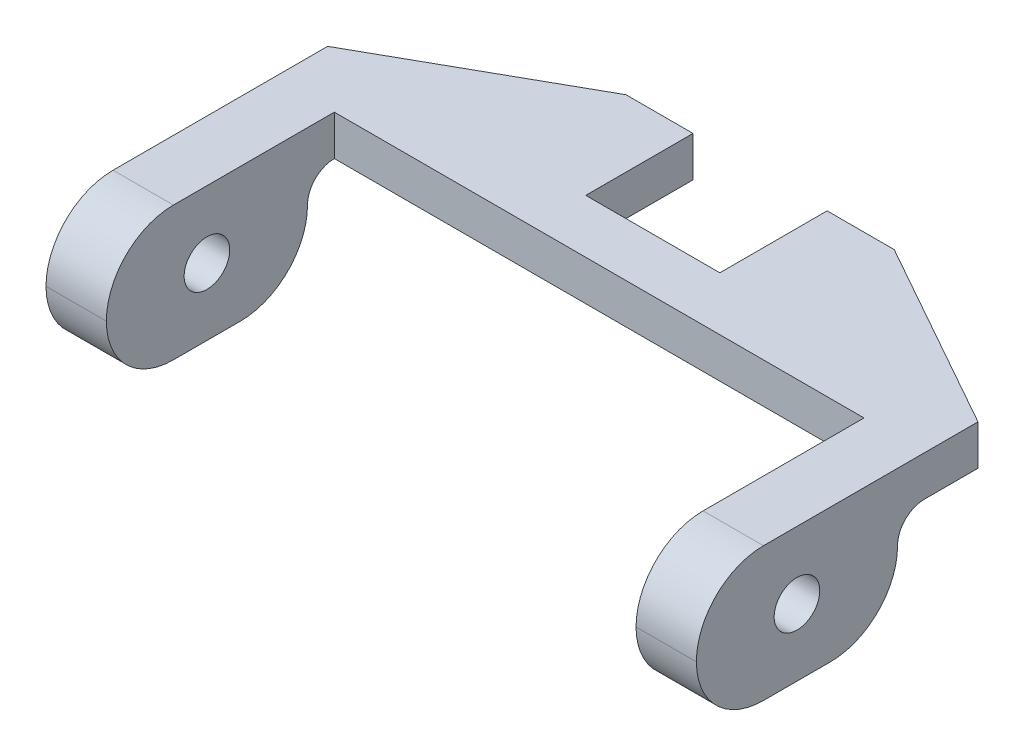
ISO-10303-21;
HEADER;
FILE_DESCRIPTION(('STEP AP214'),'2;1');
FILE_NAME('part.step','',(''),(''),'','','');
FILE_SCHEMA(('AUTOMOTIVE_DESIGN { 1 0 10303 214 1 1 1 1 }'));
ENDSEC;
DATA;
#1=APPLICATION_CONTEXT('core data for automotive mechanical design processes');
#2=APPLICATION_PROTOCOL_DEFINITION('international standard','automotive_design',2000,#1);
#3=PRODUCT_CONTEXT('',#1,'mechanical');
#4=PRODUCT('Part','Part','',(#3));
#5=PRODUCT_RELATED_PRODUCT_CATEGORY('part','',(#4));
#6=PRODUCT_DEFINITION_FORMATION('','',#4);
#7=PRODUCT_DEFINITION_CONTEXT('part definition',#1,'design');
#8=PRODUCT_DEFINITION('design','',#6,#7);
#9=PRODUCT_DEFINITION_SHAPE('','',#8);
#10=(LENGTH_UNIT() NAMED_UNIT(*) SI_UNIT(.MILLI.,.METRE.));
#11=(NAMED_UNIT(*) PLANE_ANGLE_UNIT() SI_UNIT($,.RADIAN.));
#12=(NAMED_UNIT(*) SI_UNIT($,.STERADIAN.) SOLID_ANGLE_UNIT());
#13=UNCERTAINTY_MEASURE_WITH_UNIT(LENGTH_MEASURE(1.E-05),#10,'distance_accuracy_value','');
#14=(GEOMETRIC_REPRESENTATION_CONTEXT(3) GLOBAL_UNCERTAINTY_ASSIGNED_CONTEXT((#13)) GLOBAL_UNIT_ASSIGNED_CONTEXT((#10,
#11,#12)) REPRESENTATION_CONTEXT('',''));
#15=CARTESIAN_POINT('',(0.,0.,0.));
#16=DIRECTION('',(0.,0.,1.));
#17=DIRECTION('',(1.,0.,0.));
#18=AXIS2_PLACEMENT_3D('',#15,#16,#17);
#19=CARTESIAN_POINT('',(-19.75,3.,4.));
#20=DIRECTION('',(-1.,0.,0.));
#21=DIRECTION('',(0.,0.,1.));
#22=AXIS2_PLACEMENT_3D('',#19,#20,#21);
#23=PLANE('',#22);
#24=DIRECTION('',(0.,0.,-1.));
#25=VECTOR('',#24,1.);
#26=CARTESIAN_POINT('',(-19.75,-7.,21.));
#27=LINE('',#26,#25);
#28=CARTESIAN_POINT('',(-19.75,-7.,16.));
#29=VERTEX_POINT('',#28);
#30=CARTESIAN_POINT('',(-19.75,-7.,11.));
#31=VERTEX_POINT('',#30);
#32=EDGE_CURVE('E395',#29,#31,#27,.T.);
#33=ORIENTED_EDGE('',*,*,#32,.T.);
#34=CARTESIAN_POINT('',(-19.75,-2.,11.));
#35=DIRECTION('',(-1.,0.,0.));
#36=DIRECTION('',(0.,0.,1.));
#37=AXIS2_PLACEMENT_3D('',#34,#35,#36);
#38=CIRCLE('',#37,5.);
#39=CARTESIAN_POINT('',(-19.75,-2.,6.));
#40=VERTEX_POINT('',#39);
#41=EDGE_CURVE('E281',#31,#40,#38,.F.);
#42=ORIENTED_EDGE('',*,*,#41,.T.);
#43=CARTESIAN_POINT('',(-19.75,-2.,4.));
#44=DIRECTION('',(-1.,0.,0.));
#45=DIRECTION('',(0.,0.,1.));
#46=AXIS2_PLACEMENT_3D('',#43,#44,#45);
#47=CIRCLE('',#46,2.);
#48=CARTESIAN_POINT('',(-19.75,0.,4.));
#49=VERTEX_POINT('',#48);
#50=EDGE_CURVE('E195',#40,#49,#47,.T.);
#51=ORIENTED_EDGE('',*,*,#50,.T.);
#52=DIRECTION('',(0.,-1.,0.));
#53=VECTOR('',#52,1.);
#54=CARTESIAN_POINT('',(-19.75,3.,4.));
#55=LINE('',#54,#53);
#56=CARTESIAN_POINT('',(-19.75,3.,4.));
#57=VERTEX_POINT('',#56);
#58=EDGE_CURVE('E191',#57,#49,#55,.T.);
#59=ORIENTED_EDGE('',*,*,#58,.F.);
#60=DIRECTION('',(0.,0.,-1.));
#61=VECTOR('',#60,1.);
#62=CARTESIAN_POINT('',(-19.75,3.,4.));
#63=LINE('',#62,#61);
#64=CARTESIAN_POINT('',(-19.75,3.,16.));
#65=VERTEX_POINT('',#64);
#66=EDGE_CURVE('E176',#65,#57,#63,.T.);
#67=ORIENTED_EDGE('',*,*,#66,.F.);
#68=CARTESIAN_POINT('',(-19.75,-2.,16.));
#69=DIRECTION('',(-1.,0.,0.));
#70=DIRECTION('',(0.,0.,1.));
#71=AXIS2_PLACEMENT_3D('',#68,#69,#70);
#72=CIRCLE('',#71,5.);
#73=CARTESIAN_POINT('',(-19.75,-2.,21.));
#74=VERTEX_POINT('',#73);
#75=EDGE_CURVE('E277',#65,#74,#72,.F.);
#76=ORIENTED_EDGE('',*,*,#75,.T.);
#77=CARTESIAN_POINT('',(-19.75,-2.,16.));
#78=DIRECTION('',(-1.,0.,0.));
#79=DIRECTION('',(0.,0.,1.));
#80=AXIS2_PLACEMENT_3D('',#77,#78,#79);
#81=CIRCLE('',#80,5.);
#82=EDGE_CURVE('E279',#74,#29,#81,.F.);
#83=ORIENTED_EDGE('',*,*,#82,.T.);
#84=EDGE_LOOP('',(#33,#42,#51,#59,#67,#76,#83));
#85=FACE_BOUND('',#84,.T.);
#86=CARTESIAN_POINT('',(-19.75,-2.,13.5));
#87=DIRECTION('',(-1.,0.,0.));
#88=DIRECTION('',(0.,0.,1.));
#89=AXIS2_PLACEMENT_3D('',#86,#87,#88);
#90=CIRCLE('',#89,1.7);
#91=CARTESIAN_POINT('',(-19.75,-2.,15.2));
#92=VERTEX_POINT('',#91);
#93=EDGE_CURVE('E307',#92,#92,#90,.T.);
#94=ORIENTED_EDGE('',*,*,#93,.T.);
#95=EDGE_LOOP('',(#94));
#96=FACE_BOUND('',#95,.T.);
#97=ADVANCED_FACE('F35',(#85,#96),#23,.F.);
#98=CARTESIAN_POINT('',(-24.25,3.,21.));
#99=DIRECTION('',(1.,0.,0.));
#100=DIRECTION('',(0.,0.,-1.));
#101=AXIS2_PLACEMENT_3D('',#98,#99,#100);
#102=PLANE('',#101);
#103=DIRECTION('',(0.,0.,1.));
#104=VECTOR('',#103,1.);
#105=CARTESIAN_POINT('',(-24.25,0.,21.));
#106=LINE('',#105,#104);
#107=CARTESIAN_POINT('',(-24.25,0.,0.));
#108=VERTEX_POINT('',#107);
#109=CARTESIAN_POINT('',(-24.25,0.,4.00000000000001));
#110=VERTEX_POINT('',#109);
#111=EDGE_CURVE('E188',#108,#110,#106,.T.);
#112=ORIENTED_EDGE('',*,*,#111,.T.);
#113=CARTESIAN_POINT('',(-24.25,-2.,4.));
#114=DIRECTION('',(1.,0.,0.));
#115=DIRECTION('',(0.,0.,-1.));
#116=AXIS2_PLACEMENT_3D('',#113,#114,#115);
#117=CIRCLE('',#116,2.);
#118=CARTESIAN_POINT('',(-24.25,-2.,6.));
#119=VERTEX_POINT('',#118);
#120=EDGE_CURVE('E57',#110,#119,#117,.T.);
#121=ORIENTED_EDGE('',*,*,#120,.T.);
#122=CARTESIAN_POINT('',(-24.25,-2.,11.));
#123=DIRECTION('',(1.,0.,0.));
#124=DIRECTION('',(0.,0.,-1.));
#125=AXIS2_PLACEMENT_3D('',#122,#123,#124);
#126=CIRCLE('',#125,5.);
#127=CARTESIAN_POINT('',(-24.25,-7.,11.));
#128=VERTEX_POINT('',#127);
#129=EDGE_CURVE('E254',#119,#128,#126,.F.);
#130=ORIENTED_EDGE('',*,*,#129,.T.);
#131=DIRECTION('',(0.,0.,1.));
#132=VECTOR('',#131,1.);
#133=CARTESIAN_POINT('',(-24.25,-7.,21.));
#134=LINE('',#133,#132);
#135=CARTESIAN_POINT('',(-24.25,-7.,16.));
#136=VERTEX_POINT('',#135);
#137=EDGE_CURVE('E400',#128,#136,#134,.T.);
#138=ORIENTED_EDGE('',*,*,#137,.T.);
#139=CARTESIAN_POINT('',(-24.25,-2.,16.));
#140=DIRECTION('',(1.,0.,0.));
#141=DIRECTION('',(0.,0.,-1.));
#142=AXIS2_PLACEMENT_3D('',#139,#140,#141);
#143=CIRCLE('',#142,5.);
#144=CARTESIAN_POINT('',(-24.25,-2.,21.));
#145=VERTEX_POINT('',#144);
#146=EDGE_CURVE('E265',#136,#145,#143,.F.);
#147=ORIENTED_EDGE('',*,*,#146,.T.);
#148=CARTESIAN_POINT('',(-24.25,-2.,16.));
#149=DIRECTION('',(1.,0.,0.));
#150=DIRECTION('',(0.,0.,-1.));
#151=AXIS2_PLACEMENT_3D('',#148,#149,#150);
#152=CIRCLE('',#151,5.);
#153=CARTESIAN_POINT('',(-24.25,3.,16.));
#154=VERTEX_POINT('',#153);
#155=EDGE_CURVE('E268',#145,#154,#152,.F.);
#156=ORIENTED_EDGE('',*,*,#155,.T.);
#157=DIRECTION('',(0.,0.,1.));
#158=VECTOR('',#157,1.);
#159=CARTESIAN_POINT('',(-24.25,3.,21.));
#160=LINE('',#159,#158);
#161=CARTESIAN_POINT('',(-24.25,3.,0.));
#162=VERTEX_POINT('',#161);
#163=EDGE_CURVE('E226',#162,#154,#160,.T.);
#164=ORIENTED_EDGE('',*,*,#163,.F.);
#165=DIRECTION('',(0.,-1.,0.));
#166=VECTOR('',#165,1.);
#167=CARTESIAN_POINT('',(-24.25,3.,0.));
#168=LINE('',#167,#166);
#169=EDGE_CURVE('E228',#162,#108,#168,.T.);
#170=ORIENTED_EDGE('',*,*,#169,.T.);
#171=EDGE_LOOP('',(#112,#121,#130,#138,#147,#156,#164,#170));
#172=FACE_BOUND('',#171,.T.);
#173=CARTESIAN_POINT('',(-24.25,-2.,13.5));
#174=DIRECTION('',(1.,0.,0.));
#175=DIRECTION('',(0.,0.,-1.));
#176=AXIS2_PLACEMENT_3D('',#173,#174,#175);
#177=CIRCLE('',#176,1.7);
#178=CARTESIAN_POINT('',(-24.25,-2.,15.2));
#179=VERTEX_POINT('',#178);
#180=EDGE_CURVE('E312',#179,#179,#177,.T.);
#181=ORIENTED_EDGE('',*,*,#180,.T.);
#182=EDGE_LOOP('',(#181));
#183=FACE_BOUND('',#182,.T.);
#184=ADVANCED_FACE('F251',(#172,#183),#102,.F.);
#185=CARTESIAN_POINT('',(-19.75,3.,4.));
#186=DIRECTION('',(0.,0.,-1.));
#187=DIRECTION('',(-1.,0.,0.));
#188=AXIS2_PLACEMENT_3D('',#185,#186,#187);
#189=PLANE('',#188);
#190=DIRECTION('',(1.,0.,0.));
#191=VECTOR('',#190,1.);
#192=CARTESIAN_POINT('',(-19.75,0.,4.));
#193=LINE('',#192,#191);
#194=CARTESIAN_POINT('',(19.75,0.,4.));
#195=VERTEX_POINT('',#194);
#196=EDGE_CURVE('E229',#49,#195,#193,.T.);
#197=ORIENTED_EDGE('',*,*,#196,.T.);
#198=DIRECTION('',(0.,-1.,0.));
#199=VECTOR('',#198,1.);
#200=CARTESIAN_POINT('',(19.75,3.,4.));
#201=LINE('',#200,#199);
#202=CARTESIAN_POINT('',(19.75,3.,4.));
#203=VERTEX_POINT('',#202);
#204=EDGE_CURVE('E200',#203,#195,#201,.T.);
#205=ORIENTED_EDGE('',*,*,#204,.F.);
#206=DIRECTION('',(1.,0.,0.));
#207=VECTOR('',#206,1.);
#208=CARTESIAN_POINT('',(-19.75,3.,4.));
#209=LINE('',#208,#207);
#210=EDGE_CURVE('E182',#57,#203,#209,.T.);
#211=ORIENTED_EDGE('',*,*,#210,.F.);
#212=ORIENTED_EDGE('',*,*,#58,.T.);
#213=EDGE_LOOP('',(#197,#205,#211,#212));
#214=FACE_BOUND('',#213,.T.);
#215=ADVANCED_FACE('F202',(#214),#189,.F.);
#216=CARTESIAN_POINT('',(19.75,3.,4.));
#217=DIRECTION('',(1.,0.,0.));
#218=DIRECTION('',(0.,0.,-1.));
#219=AXIS2_PLACEMENT_3D('',#216,#217,#218);
#220=PLANE('',#219);
#221=CARTESIAN_POINT('',(19.75,-2.,13.5));
#222=DIRECTION('',(1.,0.,0.));
#223=DIRECTION('',(0.,0.,-1.));
#224=AXIS2_PLACEMENT_3D('',#221,#222,#223);
#225=CIRCLE('',#224,1.7);
#226=CARTESIAN_POINT('',(19.75,-2.,11.8));
#227=VERTEX_POINT('',#226);
#228=EDGE_CURVE('E409',#227,#227,#225,.F.);
#229=ORIENTED_EDGE('',*,*,#228,.F.);
#230=EDGE_LOOP('',(#229));
#231=FACE_BOUND('',#230,.T.);
#232=ORIENTED_EDGE('',*,*,#204,.T.);
#233=CARTESIAN_POINT('',(19.75,-2.,4.));
#234=DIRECTION('',(1.,0.,0.));
#235=DIRECTION('',(0.,0.,-1.));
#236=AXIS2_PLACEMENT_3D('',#233,#234,#235);
#237=CIRCLE('',#236,2.);
#238=CARTESIAN_POINT('',(19.75,-2.,6.));
#239=VERTEX_POINT('',#238);
#240=EDGE_CURVE('E11',#195,#239,#237,.T.);
#241=ORIENTED_EDGE('',*,*,#240,.T.);
#242=CARTESIAN_POINT('',(19.75,-2.,11.));
#243=DIRECTION('',(1.,0.,0.));
#244=DIRECTION('',(0.,0.,-1.));
#245=AXIS2_PLACEMENT_3D('',#242,#243,#244);
#246=CIRCLE('',#245,5.);
#247=CARTESIAN_POINT('',(19.75,-7.,11.));
#248=VERTEX_POINT('',#247);
#249=EDGE_CURVE('E245',#239,#248,#246,.F.);
#250=ORIENTED_EDGE('',*,*,#249,.T.);
#251=DIRECTION('',(0.,0.,-1.));
#252=VECTOR('',#251,1.);
#253=CARTESIAN_POINT('',(19.75,-7.,21.));
#254=LINE('',#253,#252);
#255=CARTESIAN_POINT('',(19.75,-7.,16.));
#256=VERTEX_POINT('',#255);
#257=EDGE_CURVE('E232',#256,#248,#254,.T.);
#258=ORIENTED_EDGE('',*,*,#257,.F.);
#259=CARTESIAN_POINT('',(19.75,-2.,16.));
#260=DIRECTION('',(1.,0.,0.));
#261=DIRECTION('',(0.,0.,-1.));
#262=AXIS2_PLACEMENT_3D('',#259,#260,#261);
#263=CIRCLE('',#262,5.);
#264=CARTESIAN_POINT('',(19.75,-2.,21.));
#265=VERTEX_POINT('',#264);
#266=EDGE_CURVE('E303',#256,#265,#263,.F.);
#267=ORIENTED_EDGE('',*,*,#266,.T.);
#268=CARTESIAN_POINT('',(19.75,-2.,16.));
#269=DIRECTION('',(1.,0.,0.));
#270=DIRECTION('',(0.,0.,-1.));
#271=AXIS2_PLACEMENT_3D('',#268,#269,#270);
#272=CIRCLE('',#271,5.);
#273=CARTESIAN_POINT('',(19.75,3.,16.));
#274=VERTEX_POINT('',#273);
#275=EDGE_CURVE('E301',#265,#274,#272,.F.);
#276=ORIENTED_EDGE('',*,*,#275,.T.);
#277=DIRECTION('',(0.,0.,1.));
#278=VECTOR('',#277,1.);
#279=CARTESIAN_POINT('',(19.75,3.,4.));
#280=LINE('',#279,#278);
#281=EDGE_CURVE('E205',#203,#274,#280,.T.);
#282=ORIENTED_EDGE('',*,*,#281,.F.);
#283=EDGE_LOOP('',(#232,#241,#250,#258,#267,#276,#282));
#284=FACE_BOUND('',#283,.T.);
#285=ADVANCED_FACE('F326',(#231,#284),#220,.F.);
#286=CARTESIAN_POINT('',(24.25,3.,21.));
#287=DIRECTION('',(-1.,0.,0.));
#288=DIRECTION('',(0.,0.,1.));
#289=AXIS2_PLACEMENT_3D('',#286,#287,#288);
#290=PLANE('',#289);
#291=CARTESIAN_POINT('',(24.25,-2.,13.5));
#292=DIRECTION('',(1.,0.,0.));
#293=DIRECTION('',(0.,0.,-1.));
#294=AXIS2_PLACEMENT_3D('',#291,#292,#293);
#295=CIRCLE('',#294,1.7);
#296=CARTESIAN_POINT('',(24.25,-2.,11.8));
#297=VERTEX_POINT('',#296);
#298=EDGE_CURVE('E399',#297,#297,#295,.T.);
#299=ORIENTED_EDGE('',*,*,#298,.F.);
#300=EDGE_LOOP('',(#299));
#301=FACE_BOUND('',#300,.T.);
#302=DIRECTION('',(0.,0.,1.));
#303=VECTOR('',#302,1.);
#304=CARTESIAN_POINT('',(24.25,-7.,21.));
#305=LINE('',#304,#303);
#306=CARTESIAN_POINT('',(24.25,-7.,11.));
#307=VERTEX_POINT('',#306);
#308=CARTESIAN_POINT('',(24.25,-7.,16.));
#309=VERTEX_POINT('',#308);
#310=EDGE_CURVE('E412',#307,#309,#305,.T.);
#311=ORIENTED_EDGE('',*,*,#310,.F.);
#312=CARTESIAN_POINT('',(24.25,-2.,11.));
#313=DIRECTION('',(-1.,0.,0.));
#314=DIRECTION('',(0.,0.,1.));
#315=AXIS2_PLACEMENT_3D('',#312,#313,#314);
#316=CIRCLE('',#315,5.);
#317=CARTESIAN_POINT('',(24.25,-2.,6.));
#318=VERTEX_POINT('',#317);
#319=EDGE_CURVE('E296',#307,#318,#316,.F.);
#320=ORIENTED_EDGE('',*,*,#319,.T.);
#321=CARTESIAN_POINT('',(24.25,-2.,4.));
#322=DIRECTION('',(-1.,0.,0.));
#323=DIRECTION('',(0.,0.,1.));
#324=AXIS2_PLACEMENT_3D('',#321,#322,#323);
#325=CIRCLE('',#324,2.);
#326=CARTESIAN_POINT('',(24.25,0.,4.00000000000001));
#327=VERTEX_POINT('',#326);
#328=EDGE_CURVE('E43',#318,#327,#325,.T.);
#329=ORIENTED_EDGE('',*,*,#328,.T.);
#330=DIRECTION('',(0.,0.,-1.));
#331=VECTOR('',#330,1.);
#332=CARTESIAN_POINT('',(24.25,0.,21.));
#333=LINE('',#332,#331);
#334=CARTESIAN_POINT('',(24.25,0.,0.));
#335=VERTEX_POINT('',#334);
#336=EDGE_CURVE('E231',#327,#335,#333,.T.);
#337=ORIENTED_EDGE('',*,*,#336,.T.);
#338=DIRECTION('',(0.,-1.,0.));
#339=VECTOR('',#338,1.);
#340=CARTESIAN_POINT('',(24.25,3.,0.));
#341=LINE('',#340,#339);
#342=CARTESIAN_POINT('',(24.25,3.,0.));
#343=VERTEX_POINT('',#342);
#344=EDGE_CURVE('E333',#343,#335,#341,.T.);
#345=ORIENTED_EDGE('',*,*,#344,.F.);
#346=DIRECTION('',(0.,0.,-1.));
#347=VECTOR('',#346,1.);
#348=CARTESIAN_POINT('',(24.25,3.,21.));
#349=LINE('',#348,#347);
#350=CARTESIAN_POINT('',(24.25,3.,16.));
#351=VERTEX_POINT('',#350);
#352=EDGE_CURVE('E207',#351,#343,#349,.T.);
#353=ORIENTED_EDGE('',*,*,#352,.F.);
#354=CARTESIAN_POINT('',(24.25,-2.,16.));
#355=DIRECTION('',(-1.,0.,0.));
#356=DIRECTION('',(0.,0.,1.));
#357=AXIS2_PLACEMENT_3D('',#354,#355,#356);
#358=CIRCLE('',#357,5.);
#359=CARTESIAN_POINT('',(24.25,-2.,21.));
#360=VERTEX_POINT('',#359);
#361=EDGE_CURVE('E292',#351,#360,#358,.F.);
#362=ORIENTED_EDGE('',*,*,#361,.T.);
#363=CARTESIAN_POINT('',(24.25,-2.,16.));
#364=DIRECTION('',(-1.,0.,0.));
#365=DIRECTION('',(0.,0.,1.));
#366=AXIS2_PLACEMENT_3D('',#363,#364,#365);
#367=CIRCLE('',#366,5.);
#368=EDGE_CURVE('E294',#360,#309,#367,.F.);
#369=ORIENTED_EDGE('',*,*,#368,.T.);
#370=EDGE_LOOP('',(#311,#320,#329,#337,#345,#353,#362,#369));
#371=FACE_BOUND('',#370,.T.);
#372=ADVANCED_FACE('F331',(#301,#371),#290,.F.);
#373=CARTESIAN_POINT('',(10.,3.,-8.));
#374=DIRECTION('',(-0.489534756707638,0.,0.871983785385481));
#375=DIRECTION('',(0.871983785385481,0.,0.489534756707639));
#376=AXIS2_PLACEMENT_3D('',#373,#374,#375);
#377=PLANE('',#376);
#378=DIRECTION('',(-0.871983785385481,0.,-0.489534756707639));
#379=VECTOR('',#378,1.);
#380=CARTESIAN_POINT('',(10.,0.,-8.));
#381=LINE('',#380,#379);
#382=CARTESIAN_POINT('',(10.,0.,-8.));
#383=VERTEX_POINT('',#382);
#384=EDGE_CURVE('E235',#335,#383,#381,.T.);
#385=ORIENTED_EDGE('',*,*,#384,.T.);
#386=DIRECTION('',(0.,-1.,0.));
#387=VECTOR('',#386,1.);
#388=CARTESIAN_POINT('',(10.,3.,-8.));
#389=LINE('',#388,#387);
#390=CARTESIAN_POINT('',(10.,3.,-8.));
#391=VERTEX_POINT('',#390);
#392=EDGE_CURVE('E337',#391,#383,#389,.T.);
#393=ORIENTED_EDGE('',*,*,#392,.F.);
#394=DIRECTION('',(-0.871983785385481,0.,-0.489534756707639));
#395=VECTOR('',#394,1.);
#396=CARTESIAN_POINT('',(10.,3.,-8.));
#397=LINE('',#396,#395);
#398=EDGE_CURVE('E212',#343,#391,#397,.T.);
#399=ORIENTED_EDGE('',*,*,#398,.F.);
#400=ORIENTED_EDGE('',*,*,#344,.T.);
#401=EDGE_LOOP('',(#385,#393,#399,#400));
#402=FACE_BOUND('',#401,.T.);
#403=ADVANCED_FACE('F340',(#402),#377,.F.);
#404=CARTESIAN_POINT('',(5.,3.,-8.));
#405=DIRECTION('',(0.,0.,1.));
#406=DIRECTION('',(1.,0.,0.));
#407=AXIS2_PLACEMENT_3D('',#404,#405,#406);
#408=PLANE('',#407);
#409=DIRECTION('',(-1.,0.,0.));
#410=VECTOR('',#409,1.);
#411=CARTESIAN_POINT('',(5.,0.,-8.));
#412=LINE('',#411,#410);
#413=CARTESIAN_POINT('',(5.,0.,-8.));
#414=VERTEX_POINT('',#413);
#415=EDGE_CURVE('E351',#383,#414,#412,.T.);
#416=ORIENTED_EDGE('',*,*,#415,.T.);
#417=DIRECTION('',(0.,-1.,0.));
#418=VECTOR('',#417,1.);
#419=CARTESIAN_POINT('',(5.,3.,-8.));
#420=LINE('',#419,#418);
#421=CARTESIAN_POINT('',(5.,3.,-8.));
#422=VERTEX_POINT('',#421);
#423=EDGE_CURVE('E348',#422,#414,#420,.T.);
#424=ORIENTED_EDGE('',*,*,#423,.F.);
#425=DIRECTION('',(-1.,0.,0.));
#426=VECTOR('',#425,1.);
#427=CARTESIAN_POINT('',(5.,3.,-8.));
#428=LINE('',#427,#426);
#429=EDGE_CURVE('E214',#391,#422,#428,.T.);
#430=ORIENTED_EDGE('',*,*,#429,.F.);
#431=ORIENTED_EDGE('',*,*,#392,.T.);
#432=EDGE_LOOP('',(#416,#424,#430,#431));
#433=FACE_BOUND('',#432,.T.);
#434=ADVANCED_FACE('F349',(#433),#408,.F.);
#435=CARTESIAN_POINT('',(5.,3.,0.));
#436=DIRECTION('',(1.,0.,0.));
#437=DIRECTION('',(0.,0.,-1.));
#438=AXIS2_PLACEMENT_3D('',#435,#436,#437);
#439=PLANE('',#438);
#440=DIRECTION('',(0.,0.,1.));
#441=VECTOR('',#440,1.);
#442=CARTESIAN_POINT('',(5.,0.,0.));
#443=LINE('',#442,#441);
#444=CARTESIAN_POINT('',(5.,0.,0.));
#445=VERTEX_POINT('',#444);
#446=EDGE_CURVE('E359',#414,#445,#443,.T.);
#447=ORIENTED_EDGE('',*,*,#446,.T.);
#448=DIRECTION('',(0.,-1.,0.));
#449=VECTOR('',#448,1.);
#450=CARTESIAN_POINT('',(5.,3.,0.));
#451=LINE('',#450,#449);
#452=CARTESIAN_POINT('',(5.,3.,0.));
#453=VERTEX_POINT('',#452);
#454=EDGE_CURVE('E354',#453,#445,#451,.T.);
#455=ORIENTED_EDGE('',*,*,#454,.F.);
#456=DIRECTION('',(0.,0.,1.));
#457=VECTOR('',#456,1.);
#458=CARTESIAN_POINT('',(5.,3.,0.));
#459=LINE('',#458,#457);
#460=EDGE_CURVE('E216',#422,#453,#459,.T.);
#461=ORIENTED_EDGE('',*,*,#460,.F.);
#462=ORIENTED_EDGE('',*,*,#423,.T.);
#463=EDGE_LOOP('',(#447,#455,#461,#462));
#464=FACE_BOUND('',#463,.T.);
#465=ADVANCED_FACE('F356',(#464),#439,.F.);
#466=CARTESIAN_POINT('',(-5.,3.,0.));
#467=DIRECTION('',(0.,0.,1.));
#468=DIRECTION('',(1.,0.,0.));
#469=AXIS2_PLACEMENT_3D('',#466,#467,#468);
#470=PLANE('',#469);
#471=DIRECTION('',(-1.,0.,0.));
#472=VECTOR('',#471,1.);
#473=CARTESIAN_POINT('',(-5.,0.,0.));
#474=LINE('',#473,#472);
#475=CARTESIAN_POINT('',(-5.,0.,0.));
#476=VERTEX_POINT('',#475);
#477=EDGE_CURVE('E436',#445,#476,#474,.T.);
#478=ORIENTED_EDGE('',*,*,#477,.T.);
#479=DIRECTION('',(0.,-1.,0.));
#480=VECTOR('',#479,1.);
#481=CARTESIAN_POINT('',(-5.,3.,0.));
#482=LINE('',#481,#480);
#483=CARTESIAN_POINT('',(-5.,3.,0.));
#484=VERTEX_POINT('',#483);
#485=EDGE_CURVE('E362',#484,#476,#482,.T.);
#486=ORIENTED_EDGE('',*,*,#485,.F.);
#487=DIRECTION('',(-1.,0.,0.));
#488=VECTOR('',#487,1.);
#489=CARTESIAN_POINT('',(-5.,3.,0.));
#490=LINE('',#489,#488);
#491=EDGE_CURVE('E218',#453,#484,#490,.T.);
#492=ORIENTED_EDGE('',*,*,#491,.F.);
#493=ORIENTED_EDGE('',*,*,#454,.T.);
#494=EDGE_LOOP('',(#478,#486,#492,#493));
#495=FACE_BOUND('',#494,.T.);
#496=ADVANCED_FACE('F365',(#495),#470,.F.);
#497=CARTESIAN_POINT('',(-5.,3.,0.));
#498=DIRECTION('',(-1.,0.,0.));
#499=DIRECTION('',(0.,0.,1.));
#500=AXIS2_PLACEMENT_3D('',#497,#498,#499);
#501=PLANE('',#500);
#502=DIRECTION('',(0.,0.,-1.));
#503=VECTOR('',#502,1.);
#504=CARTESIAN_POINT('',(-5.,0.,0.));
#505=LINE('',#504,#503);
#506=CARTESIAN_POINT('',(-5.,0.,-8.));
#507=VERTEX_POINT('',#506);
#508=EDGE_CURVE('E376',#476,#507,#505,.T.);
#509=ORIENTED_EDGE('',*,*,#508,.T.);
#510=DIRECTION('',(0.,-1.,0.));
#511=VECTOR('',#510,1.);
#512=CARTESIAN_POINT('',(-5.,3.,-8.));
#513=LINE('',#512,#511);
#514=CARTESIAN_POINT('',(-5.,3.,-8.));
#515=VERTEX_POINT('',#514);
#516=EDGE_CURVE('E373',#515,#507,#513,.T.);
#517=ORIENTED_EDGE('',*,*,#516,.F.);
#518=DIRECTION('',(0.,0.,-1.));
#519=VECTOR('',#518,1.);
#520=CARTESIAN_POINT('',(-5.,3.,0.));
#521=LINE('',#520,#519);
#522=EDGE_CURVE('E220',#484,#515,#521,.T.);
#523=ORIENTED_EDGE('',*,*,#522,.F.);
#524=ORIENTED_EDGE('',*,*,#485,.T.);
#525=EDGE_LOOP('',(#509,#517,#523,#524));
#526=FACE_BOUND('',#525,.T.);
#527=ADVANCED_FACE('F374',(#526),#501,.F.);
#528=CARTESIAN_POINT('',(-5.,3.,-8.));
#529=DIRECTION('',(0.,0.,1.));
#530=DIRECTION('',(1.,0.,0.));
#531=AXIS2_PLACEMENT_3D('',#528,#529,#530);
#532=PLANE('',#531);
#533=DIRECTION('',(-1.,0.,0.));
#534=VECTOR('',#533,1.);
#535=CARTESIAN_POINT('',(-5.,0.,-8.));
#536=LINE('',#535,#534);
#537=CARTESIAN_POINT('',(-10.,0.,-8.));
#538=VERTEX_POINT('',#537);
#539=EDGE_CURVE('E384',#507,#538,#536,.T.);
#540=ORIENTED_EDGE('',*,*,#539,.T.);
#541=DIRECTION('',(0.,-1.,0.));
#542=VECTOR('',#541,1.);
#543=CARTESIAN_POINT('',(-10.,3.,-8.));
#544=LINE('',#543,#542);
#545=CARTESIAN_POINT('',(-10.,3.,-8.));
#546=VERTEX_POINT('',#545);
#547=EDGE_CURVE('E379',#546,#538,#544,.T.);
#548=ORIENTED_EDGE('',*,*,#547,.F.);
#549=DIRECTION('',(-1.,0.,0.));
#550=VECTOR('',#549,1.);
#551=CARTESIAN_POINT('',(-5.,3.,-8.));
#552=LINE('',#551,#550);
#553=EDGE_CURVE('E222',#515,#546,#552,.T.);
#554=ORIENTED_EDGE('',*,*,#553,.F.);
#555=ORIENTED_EDGE('',*,*,#516,.T.);
#556=EDGE_LOOP('',(#540,#548,#554,#555));
#557=FACE_BOUND('',#556,.T.);
#558=ADVANCED_FACE('F381',(#557),#532,.F.);
#559=CARTESIAN_POINT('',(-10.,3.,-8.));
#560=DIRECTION('',(0.489534756707638,0.,0.871983785385481));
#561=DIRECTION('',(0.871983785385481,0.,-0.489534756707639));
#562=AXIS2_PLACEMENT_3D('',#559,#560,#561);
#563=PLANE('',#562);
#564=DIRECTION('',(-0.871983785385481,0.,0.489534756707639));
#565=VECTOR('',#564,1.);
#566=CARTESIAN_POINT('',(-10.,0.,-8.));
#567=LINE('',#566,#565);
#568=EDGE_CURVE('E432',#538,#108,#567,.T.);
#569=ORIENTED_EDGE('',*,*,#568,.T.);
#570=ORIENTED_EDGE('',*,*,#169,.F.);
#571=DIRECTION('',(-0.871983785385481,0.,0.489534756707639));
#572=VECTOR('',#571,1.);
#573=CARTESIAN_POINT('',(-10.,3.,-8.));
#574=LINE('',#573,#572);
#575=EDGE_CURVE('E224',#546,#162,#574,.T.);
#576=ORIENTED_EDGE('',*,*,#575,.F.);
#577=ORIENTED_EDGE('',*,*,#547,.T.);
#578=EDGE_LOOP('',(#569,#570,#576,#577));
#579=FACE_BOUND('',#578,.T.);
#580=ADVANCED_FACE('F389',(#579),#563,.F.);
#581=CARTESIAN_POINT('',(0.,3.,0.));
#582=DIRECTION('',(0.,-1.,0.));
#583=DIRECTION('',(0.,0.,-1.));
#584=AXIS2_PLACEMENT_3D('',#581,#582,#583);
#585=PLANE('',#584);
#586=ORIENTED_EDGE('',*,*,#163,.T.);
#587=DIRECTION('',(1.,0.,0.));
#588=VECTOR('',#587,1.);
#589=CARTESIAN_POINT('',(0.,3.,16.));
#590=LINE('',#589,#588);
#591=EDGE_CURVE('E185',#154,#65,#590,.T.);
#592=ORIENTED_EDGE('',*,*,#591,.T.);
#593=ORIENTED_EDGE('',*,*,#66,.T.);
#594=ORIENTED_EDGE('',*,*,#210,.T.);
#595=ORIENTED_EDGE('',*,*,#281,.T.);
#596=DIRECTION('',(1.,0.,0.));
#597=VECTOR('',#596,1.);
#598=CARTESIAN_POINT('',(0.,3.,16.));
#599=LINE('',#598,#597);
#600=EDGE_CURVE('E283',#274,#351,#599,.T.);
#601=ORIENTED_EDGE('',*,*,#600,.T.);
#602=ORIENTED_EDGE('',*,*,#352,.T.);
#603=ORIENTED_EDGE('',*,*,#398,.T.);
#604=ORIENTED_EDGE('',*,*,#429,.T.);
#605=ORIENTED_EDGE('',*,*,#460,.T.);
#606=ORIENTED_EDGE('',*,*,#491,.T.);
#607=ORIENTED_EDGE('',*,*,#522,.T.);
#608=ORIENTED_EDGE('',*,*,#553,.T.);
#609=ORIENTED_EDGE('',*,*,#575,.T.);
#610=EDGE_LOOP('',(#586,#592,#593,#594,#595,#601,#602,#603,#604,#605,#606,#607,#608,#609));
#611=FACE_BOUND('',#610,.T.);
#612=ADVANCED_FACE('F179',(#611),#585,.F.);
#613=CARTESIAN_POINT('',(0.,0.,0.));
#614=DIRECTION('',(0.,-1.,0.));
#615=DIRECTION('',(0.,0.,-1.));
#616=AXIS2_PLACEMENT_3D('',#613,#614,#615);
#617=PLANE('',#616);
#618=ORIENTED_EDGE('',*,*,#196,.F.);
#619=DIRECTION('',(-1.,0.,0.));
#620=VECTOR('',#619,1.);
#621=CARTESIAN_POINT('',(-24.25,0.,4.));
#622=LINE('',#621,#620);
#623=EDGE_CURVE('E244',#49,#110,#622,.T.);
#624=ORIENTED_EDGE('',*,*,#623,.T.);
#625=ORIENTED_EDGE('',*,*,#111,.F.);
#626=ORIENTED_EDGE('',*,*,#568,.F.);
#627=ORIENTED_EDGE('',*,*,#539,.F.);
#628=ORIENTED_EDGE('',*,*,#508,.F.);
#629=ORIENTED_EDGE('',*,*,#477,.F.);
#630=ORIENTED_EDGE('',*,*,#446,.F.);
#631=ORIENTED_EDGE('',*,*,#415,.F.);
#632=ORIENTED_EDGE('',*,*,#384,.F.);
#633=ORIENTED_EDGE('',*,*,#336,.F.);
#634=DIRECTION('',(1.,0.,0.));
#635=VECTOR('',#634,1.);
#636=CARTESIAN_POINT('',(0.,0.,4.));
#637=LINE('',#636,#635);
#638=EDGE_CURVE('E242',#327,#195,#637,.F.);
#639=ORIENTED_EDGE('',*,*,#638,.T.);
#640=EDGE_LOOP('',(#618,#624,#625,#626,#627,#628,#629,#630,#631,#632,#633,#639));
#641=FACE_BOUND('',#640,.T.);
#642=ADVANCED_FACE('F426',(#641),#617,.T.);
#643=CARTESIAN_POINT('',(0.,-7.,0.));
#644=DIRECTION('',(0.,1.,0.));
#645=DIRECTION('',(0.,0.,1.));
#646=AXIS2_PLACEMENT_3D('',#643,#644,#645);
#647=PLANE('',#646);
#648=ORIENTED_EDGE('',*,*,#257,.T.);
#649=DIRECTION('',(1.,0.,0.));
#650=VECTOR('',#649,1.);
#651=CARTESIAN_POINT('',(0.,-7.,11.));
#652=LINE('',#651,#650);
#653=EDGE_CURVE('E289',#248,#307,#652,.T.);
#654=ORIENTED_EDGE('',*,*,#653,.T.);
#655=ORIENTED_EDGE('',*,*,#310,.T.);
#656=DIRECTION('',(-1.,0.,0.));
#657=VECTOR('',#656,1.);
#658=CARTESIAN_POINT('',(0.,-7.,16.));
#659=LINE('',#658,#657);
#660=EDGE_CURVE('E286',#309,#256,#659,.T.);
#661=ORIENTED_EDGE('',*,*,#660,.T.);
#662=EDGE_LOOP('',(#648,#654,#655,#661));
#663=FACE_BOUND('',#662,.T.);
#664=ADVANCED_FACE('F417',(#663),#647,.F.);
#665=CARTESIAN_POINT('',(-24.251,-2.,13.5));
#666=DIRECTION('',(1.,0.,0.));
#667=DIRECTION('',(0.,0.,-1.));
#668=AXIS2_PLACEMENT_3D('',#665,#666,#667);
#669=CYLINDRICAL_SURFACE('',#668,1.7);
#670=ORIENTED_EDGE('',*,*,#298,.T.);
#671=EDGE_LOOP('',(#670));
#672=FACE_BOUND('',#671,.T.);
#673=ORIENTED_EDGE('',*,*,#228,.T.);
#674=EDGE_LOOP('',(#673));
#675=FACE_BOUND('',#674,.T.);
#676=ADVANCED_FACE('F444',(#672,#675),#669,.F.);
#677=CARTESIAN_POINT('',(0.,-7.,0.));
#678=DIRECTION('',(0.,1.,0.));
#679=DIRECTION('',(0.,0.,1.));
#680=AXIS2_PLACEMENT_3D('',#677,#678,#679);
#681=PLANE('',#680);
#682=ORIENTED_EDGE('',*,*,#137,.F.);
#683=DIRECTION('',(-1.,0.,0.));
#684=VECTOR('',#683,1.);
#685=CARTESIAN_POINT('',(-19.75,-7.,11.));
#686=LINE('',#685,#684);
#687=EDGE_CURVE('E263',#128,#31,#686,.F.);
#688=ORIENTED_EDGE('',*,*,#687,.T.);
#689=ORIENTED_EDGE('',*,*,#32,.F.);
#690=DIRECTION('',(1.,0.,0.));
#691=VECTOR('',#690,1.);
#692=CARTESIAN_POINT('',(0.,-7.,16.));
#693=LINE('',#692,#691);
#694=EDGE_CURVE('E264',#29,#136,#693,.F.);
#695=ORIENTED_EDGE('',*,*,#694,.T.);
#696=EDGE_LOOP('',(#682,#688,#689,#695));
#697=FACE_BOUND('',#696,.T.);
#698=ADVANCED_FACE('F398',(#697),#681,.F.);
#699=CARTESIAN_POINT('',(24.25105,-2.,13.5));
#700=DIRECTION('',(-1.,0.,0.));
#701=DIRECTION('',(0.,0.,1.));
#702=AXIS2_PLACEMENT_3D('',#699,#700,#701);
#703=CYLINDRICAL_SURFACE('',#702,1.7);
#704=CARTESIAN_POINT('',(-24.25,-2.,15.2));
#705=CARTESIAN_POINT('',(-24.203125,-2.,15.2));
#706=CARTESIAN_POINT('',(-24.15625,-2.,15.2));
#707=CARTESIAN_POINT('',(-24.0625,-2.,15.2));
#708=CARTESIAN_POINT('',(-24.015625,-2.,15.2));
#709=CARTESIAN_POINT('',(-23.921875,-2.,15.2));
#710=CARTESIAN_POINT('',(-23.875,-2.,15.2));
#711=CARTESIAN_POINT('',(-23.78125,-2.,15.2));
#712=CARTESIAN_POINT('',(-23.734375,-2.,15.2));
#713=CARTESIAN_POINT('',(-23.640625,-2.,15.2));
#714=CARTESIAN_POINT('',(-23.59375,-2.,15.2));
#715=CARTESIAN_POINT('',(-23.5,-2.,15.2));
#716=CARTESIAN_POINT('',(-23.453125,-2.,15.2));
#717=CARTESIAN_POINT('',(-23.359375,-2.,15.2));
#718=CARTESIAN_POINT('',(-23.3125,-2.,15.2));
#719=CARTESIAN_POINT('',(-23.21875,-2.,15.2));
#720=CARTESIAN_POINT('',(-23.171875,-2.,15.2));
#721=CARTESIAN_POINT('',(-23.078125,-2.,15.2));
#722=CARTESIAN_POINT('',(-23.03125,-2.,15.2));
#723=CARTESIAN_POINT('',(-22.9375,-2.,15.2));
#724=CARTESIAN_POINT('',(-22.890625,-2.,15.2));
#725=CARTESIAN_POINT('',(-22.796875,-2.,15.2));
#726=CARTESIAN_POINT('',(-22.75,-2.,15.2));
#727=CARTESIAN_POINT('',(-22.65625,-2.,15.2));
#728=CARTESIAN_POINT('',(-22.609375,-2.,15.2));
#729=CARTESIAN_POINT('',(-22.515625,-2.,15.2));
#730=CARTESIAN_POINT('',(-22.46875,-2.,15.2));
#731=CARTESIAN_POINT('',(-22.375,-2.,15.2));
#732=CARTESIAN_POINT('',(-22.328125,-2.,15.2));
#733=CARTESIAN_POINT('',(-22.234375,-2.,15.2));
#734=CARTESIAN_POINT('',(-22.1875,-2.,15.2));
#735=CARTESIAN_POINT('',(-22.09375,-2.,15.2));
#736=CARTESIAN_POINT('',(-22.046875,-2.,15.2));
#737=CARTESIAN_POINT('',(-21.953125,-2.,15.2));
#738=CARTESIAN_POINT('',(-21.90625,-2.,15.2));
#739=CARTESIAN_POINT('',(-21.8125,-2.,15.2));
#740=CARTESIAN_POINT('',(-21.765625,-2.,15.2));
#741=CARTESIAN_POINT('',(-21.671875,-2.,15.2));
#742=CARTESIAN_POINT('',(-21.625,-2.,15.2));
#743=CARTESIAN_POINT('',(-21.53125,-2.,15.2));
#744=CARTESIAN_POINT('',(-21.484375,-2.,15.2));
#745=CARTESIAN_POINT('',(-21.390625,-2.,15.2));
#746=CARTESIAN_POINT('',(-21.34375,-2.,15.2));
#747=CARTESIAN_POINT('',(-21.25,-2.,15.2));
#748=CARTESIAN_POINT('',(-21.203125,-2.,15.2));
#749=CARTESIAN_POINT('',(-21.109375,-2.,15.2));
#750=CARTESIAN_POINT('',(-21.0625,-2.,15.2));
#751=CARTESIAN_POINT('',(-20.96875,-2.,15.2));
#752=CARTESIAN_POINT('',(-20.921875,-2.,15.2));
#753=CARTESIAN_POINT('',(-20.828125,-2.,15.2));
#754=CARTESIAN_POINT('',(-20.78125,-2.,15.2));
#755=CARTESIAN_POINT('',(-20.6875,-2.,15.2));
#756=CARTESIAN_POINT('',(-20.640625,-2.,15.2));
#757=CARTESIAN_POINT('',(-20.546875,-2.,15.2));
#758=CARTESIAN_POINT('',(-20.5,-2.,15.2));
#759=CARTESIAN_POINT('',(-20.40625,-2.,15.2));
#760=CARTESIAN_POINT('',(-20.359375,-2.,15.2));
#761=CARTESIAN_POINT('',(-20.265625,-2.,15.2));
#762=CARTESIAN_POINT('',(-20.21875,-2.,15.2));
#763=CARTESIAN_POINT('',(-20.125,-2.,15.2));
#764=CARTESIAN_POINT('',(-20.078125,-2.,15.2));
#765=CARTESIAN_POINT('',(-19.984375,-2.,15.2));
#766=CARTESIAN_POINT('',(-19.9375,-2.,15.2));
#767=CARTESIAN_POINT('',(-19.84375,-2.,15.2));
#768=CARTESIAN_POINT('',(-19.796875,-2.,15.2));
#769=CARTESIAN_POINT('',(-19.75,-2.,15.2));
#770=B_SPLINE_CURVE_WITH_KNOTS('',3,(#704,#705,#706,#707,#708,#709,#710,#711,#712,#713,#714,
#715,#716,#717,#718,#719,#720,#721,#722,#723,#724,#725,#726,#727,#728,#729,#730,#731,#732,#733,
#734,#735,#736,#737,#738,#739,#740,#741,#742,#743,#744,#745,#746,#747,#748,#749,#750,#751,#752,
#753,#754,#755,#756,#757,#758,#759,#760,#761,#762,#763,#764,#765,#766,#767,#768,#769),
.UNSPECIFIED.,.F.,.F.,(4,2,2,2,2,2,2,2,2,2,2,2,2,2,2,2,2,2,2,2,2,2,2,2,2,2,2,2,2,2,2,2,4),(0.,
0.140624999999998,0.281249999999997,0.421875000000002,0.5625,0.703124999999999,
0.843750000000004,0.984375000000003,1.125,1.265625,1.40625,1.546875,1.6875,1.828125,
1.96875000000001,2.109375,2.25,2.390625,2.53125,2.671875,2.8125,2.953125,3.09375000000001,
3.234375,3.375,3.515625,3.65625,3.79687500000001,3.9375,4.078125,4.21875000000001,
4.35937500000001,4.5),.UNSPECIFIED.);
#771=EDGE_CURVE('BSEAM458',#179,#92,#770,.T.);
#772=ORIENTED_EDGE('',*,*,#180,.F.);
#773=ORIENTED_EDGE('',*,*,#93,.F.);
#774=ORIENTED_EDGE('',*,*,#771,.T.);
#775=ORIENTED_EDGE('',*,*,#771,.F.);
#776=EDGE_LOOP('',(#772,#774,#773,#775));
#777=FACE_BOUND('',#776,.T.);
#778=ADVANCED_FACE('F458',(#777),#703,.F.);
#779=CARTESIAN_POINT('',(-24.25,-2.,11.));
#780=DIRECTION('',(1.,0.,0.));
#781=DIRECTION('',(0.,0.,-1.));
#782=AXIS2_PLACEMENT_3D('',#779,#780,#781);
#783=CYLINDRICAL_SURFACE('',#782,5.);
#784=ORIENTED_EDGE('',*,*,#41,.F.);
#785=ORIENTED_EDGE('',*,*,#687,.F.);
#786=ORIENTED_EDGE('',*,*,#129,.F.);
#787=DIRECTION('',(-1.,0.,0.));
#788=VECTOR('',#787,1.);
#789=CARTESIAN_POINT('',(-24.25,-2.,6.));
#790=LINE('',#789,#788);
#791=EDGE_CURVE('E199',#40,#119,#790,.T.);
#792=ORIENTED_EDGE('',*,*,#791,.F.);
#793=EDGE_LOOP('',(#784,#785,#786,#792));
#794=FACE_BOUND('',#793,.T.);
#795=ADVANCED_FACE('F262',(#794),#783,.T.);
#796=CARTESIAN_POINT('',(0.,-2.,16.));
#797=DIRECTION('',(1.,0.,0.));
#798=DIRECTION('',(0.,0.,-1.));
#799=AXIS2_PLACEMENT_3D('',#796,#797,#798);
#800=CYLINDRICAL_SURFACE('',#799,5.);
#801=ORIENTED_EDGE('',*,*,#591,.F.);
#802=ORIENTED_EDGE('',*,*,#155,.F.);
#803=DIRECTION('',(1.,0.,0.));
#804=VECTOR('',#803,1.);
#805=CARTESIAN_POINT('',(-19.75,-2.,21.));
#806=LINE('',#805,#804);
#807=EDGE_CURVE('E305',#74,#145,#806,.F.);
#808=ORIENTED_EDGE('',*,*,#807,.F.);
#809=ORIENTED_EDGE('',*,*,#75,.F.);
#810=EDGE_LOOP('',(#801,#802,#808,#809));
#811=FACE_BOUND('',#810,.T.);
#812=ADVANCED_FACE('F393',(#811),#800,.T.);
#813=CARTESIAN_POINT('',(-19.75,-2.,16.));
#814=DIRECTION('',(1.,0.,0.));
#815=DIRECTION('',(0.,0.,-1.));
#816=AXIS2_PLACEMENT_3D('',#813,#814,#815);
#817=CYLINDRICAL_SURFACE('',#816,5.);
#818=ORIENTED_EDGE('',*,*,#146,.F.);
#819=ORIENTED_EDGE('',*,*,#694,.F.);
#820=ORIENTED_EDGE('',*,*,#82,.F.);
#821=ORIENTED_EDGE('',*,*,#807,.T.);
#822=EDGE_LOOP('',(#818,#819,#820,#821));
#823=FACE_BOUND('',#822,.T.);
#824=ADVANCED_FACE('F402',(#823),#817,.T.);
#825=CARTESIAN_POINT('',(0.,-2.,11.));
#826=DIRECTION('',(1.,0.,0.));
#827=DIRECTION('',(0.,0.,-1.));
#828=AXIS2_PLACEMENT_3D('',#825,#826,#827);
#829=CYLINDRICAL_SURFACE('',#828,5.);
#830=ORIENTED_EDGE('',*,*,#249,.F.);
#831=DIRECTION('',(1.,0.,0.));
#832=VECTOR('',#831,1.);
#833=CARTESIAN_POINT('',(24.25,-2.,6.));
#834=LINE('',#833,#832);
#835=EDGE_CURVE('E298',#318,#239,#834,.F.);
#836=ORIENTED_EDGE('',*,*,#835,.F.);
#837=ORIENTED_EDGE('',*,*,#319,.F.);
#838=ORIENTED_EDGE('',*,*,#653,.F.);
#839=EDGE_LOOP('',(#830,#836,#837,#838));
#840=FACE_BOUND('',#839,.T.);
#841=ADVANCED_FACE('F420',(#840),#829,.T.);
#842=CARTESIAN_POINT('',(0.,-2.,16.));
#843=DIRECTION('',(1.,0.,0.));
#844=DIRECTION('',(0.,0.,-1.));
#845=AXIS2_PLACEMENT_3D('',#842,#843,#844);
#846=CYLINDRICAL_SURFACE('',#845,5.);
#847=DIRECTION('',(1.,0.,0.));
#848=VECTOR('',#847,1.);
#849=CARTESIAN_POINT('',(19.75,-2.,21.));
#850=LINE('',#849,#848);
#851=EDGE_CURVE('E240',#360,#265,#850,.F.);
#852=ORIENTED_EDGE('',*,*,#851,.F.);
#853=ORIENTED_EDGE('',*,*,#361,.F.);
#854=ORIENTED_EDGE('',*,*,#600,.F.);
#855=ORIENTED_EDGE('',*,*,#275,.F.);
#856=EDGE_LOOP('',(#852,#853,#854,#855));
#857=FACE_BOUND('',#856,.T.);
#858=ADVANCED_FACE('F323',(#857),#846,.T.);
#859=CARTESIAN_POINT('',(0.,-2.,16.));
#860=DIRECTION('',(-1.,0.,0.));
#861=DIRECTION('',(0.,0.,1.));
#862=AXIS2_PLACEMENT_3D('',#859,#860,#861);
#863=CYLINDRICAL_SURFACE('',#862,5.);
#864=ORIENTED_EDGE('',*,*,#368,.F.);
#865=ORIENTED_EDGE('',*,*,#851,.T.);
#866=ORIENTED_EDGE('',*,*,#266,.F.);
#867=ORIENTED_EDGE('',*,*,#660,.F.);
#868=EDGE_LOOP('',(#864,#865,#866,#867));
#869=FACE_BOUND('',#868,.T.);
#870=ADVANCED_FACE('F318',(#869),#863,.T.);
#871=CARTESIAN_POINT('',(0.,-2.,4.));
#872=DIRECTION('',(1.,0.,0.));
#873=DIRECTION('',(0.,0.,-1.));
#874=AXIS2_PLACEMENT_3D('',#871,#872,#873);
#875=CYLINDRICAL_SURFACE('',#874,2.);
#876=ORIENTED_EDGE('',*,*,#50,.F.);
#877=ORIENTED_EDGE('',*,*,#791,.T.);
#878=ORIENTED_EDGE('',*,*,#120,.F.);
#879=ORIENTED_EDGE('',*,*,#623,.F.);
#880=EDGE_LOOP('',(#876,#877,#878,#879));
#881=FACE_BOUND('',#880,.T.);
#882=ADVANCED_FACE('F267',(#881),#875,.F.);
#883=CARTESIAN_POINT('',(24.25,-2.,4.));
#884=DIRECTION('',(1.,0.,0.));
#885=DIRECTION('',(0.,0.,-1.));
#886=AXIS2_PLACEMENT_3D('',#883,#884,#885);
#887=CYLINDRICAL_SURFACE('',#886,2.);
#888=ORIENTED_EDGE('',*,*,#240,.F.);
#889=ORIENTED_EDGE('',*,*,#638,.F.);
#890=ORIENTED_EDGE('',*,*,#328,.F.);
#891=ORIENTED_EDGE('',*,*,#835,.T.);
#892=EDGE_LOOP('',(#888,#889,#890,#891));
#893=FACE_BOUND('',#892,.T.);
#894=ADVANCED_FACE('F37',(#893),#887,.F.);
#895=CLOSED_SHELL('',(#97,#184,#215,#285,#372,#403,#434,#465,#496,#527,#558,#580,#612,#642,#664,
#676,#698,#778,#795,#812,#824,#841,#858,#870,#882,#894));
#896=MANIFOLD_SOLID_BREP('B2',#895);
#897=ADVANCED_BREP_SHAPE_REPRESENTATION('',(#18,#896),#14);
#898=SHAPE_DEFINITION_REPRESENTATION(#9,#897);
ENDSEC;
END-ISO-10303-21;
